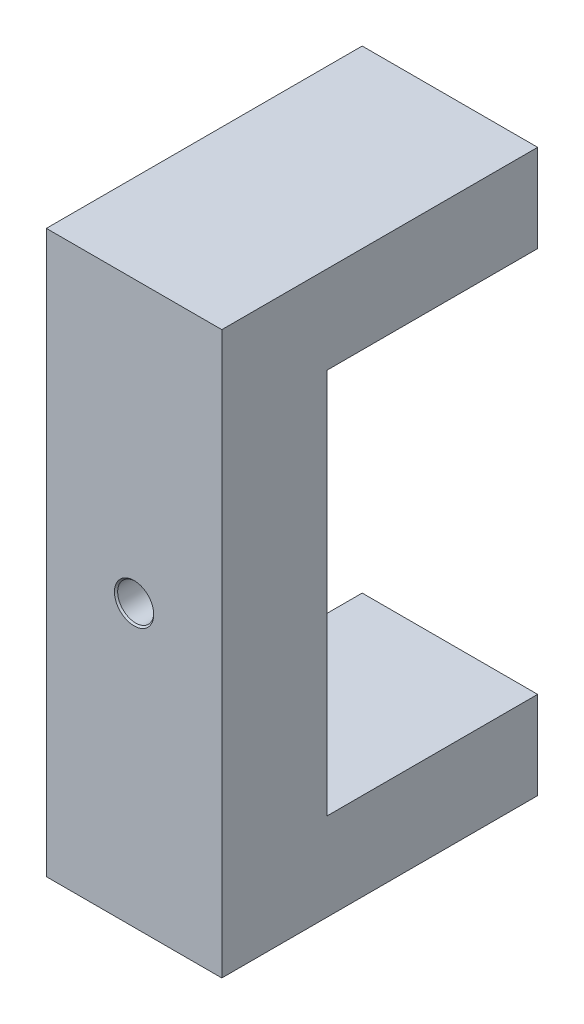
ISO-10303-21;
HEADER;
FILE_DESCRIPTION(('STEP AP214'),'2;1');
FILE_NAME('part.step','',(''),(''),'','','');
FILE_SCHEMA(('AUTOMOTIVE_DESIGN { 1 0 10303 214 1 1 1 1 }'));
ENDSEC;
DATA;
#1=APPLICATION_CONTEXT('core data for automotive mechanical design processes');
#2=APPLICATION_PROTOCOL_DEFINITION('international standard','automotive_design',2000,#1);
#3=PRODUCT_CONTEXT('',#1,'mechanical');
#4=PRODUCT('Part','Part','',(#3));
#5=PRODUCT_RELATED_PRODUCT_CATEGORY('part','',(#4));
#6=PRODUCT_DEFINITION_FORMATION('','',#4);
#7=PRODUCT_DEFINITION_CONTEXT('part definition',#1,'design');
#8=PRODUCT_DEFINITION('design','',#6,#7);
#9=PRODUCT_DEFINITION_SHAPE('','',#8);
#10=(LENGTH_UNIT() NAMED_UNIT(*) SI_UNIT(.MILLI.,.METRE.));
#11=(NAMED_UNIT(*) PLANE_ANGLE_UNIT() SI_UNIT($,.RADIAN.));
#12=(NAMED_UNIT(*) SI_UNIT($,.STERADIAN.) SOLID_ANGLE_UNIT());
#13=UNCERTAINTY_MEASURE_WITH_UNIT(LENGTH_MEASURE(1.E-05),#10,'distance_accuracy_value','');
#14=(GEOMETRIC_REPRESENTATION_CONTEXT(3) GLOBAL_UNCERTAINTY_ASSIGNED_CONTEXT((#13)) GLOBAL_UNIT_ASSIGNED_CONTEXT((#10,
#11,#12)) REPRESENTATION_CONTEXT('',''));
#15=CARTESIAN_POINT('',(0.,0.,0.));
#16=DIRECTION('',(0.,0.,1.));
#17=DIRECTION('',(1.,0.,0.));
#18=AXIS2_PLACEMENT_3D('',#15,#16,#17);
#19=CARTESIAN_POINT('',(15.875,34.925,38.1));
#20=DIRECTION('',(0.,1.,0.));
#21=DIRECTION('',(0.,0.,1.));
#22=AXIS2_PLACEMENT_3D('',#19,#20,#21);
#23=PLANE('',#22);
#24=DIRECTION('',(0.,0.,-1.));
#25=VECTOR('',#24,1.);
#26=CARTESIAN_POINT('',(-15.875,34.925,38.1));
#27=LINE('',#26,#25);
#28=CARTESIAN_POINT('',(-15.875,34.925,38.1));
#29=VERTEX_POINT('',#28);
#30=CARTESIAN_POINT('',(-15.875,34.925,0.));
#31=VERTEX_POINT('',#30);
#32=EDGE_CURVE('E130',#29,#31,#27,.T.);
#33=ORIENTED_EDGE('',*,*,#32,.T.);
#34=DIRECTION('',(-1.,0.,0.));
#35=VECTOR('',#34,1.);
#36=CARTESIAN_POINT('',(15.875,34.925,0.));
#37=LINE('',#36,#35);
#38=CARTESIAN_POINT('',(15.875,34.925,0.));
#39=VERTEX_POINT('',#38);
#40=EDGE_CURVE('E11',#39,#31,#37,.T.);
#41=ORIENTED_EDGE('',*,*,#40,.F.);
#42=DIRECTION('',(0.,0.,-1.));
#43=VECTOR('',#42,1.);
#44=CARTESIAN_POINT('',(15.875,34.925,38.1));
#45=LINE('',#44,#43);
#46=CARTESIAN_POINT('',(15.875,34.925,38.1));
#47=VERTEX_POINT('',#46);
#48=EDGE_CURVE('E145',#47,#39,#45,.T.);
#49=ORIENTED_EDGE('',*,*,#48,.F.);
#50=DIRECTION('',(-1.,0.,0.));
#51=VECTOR('',#50,1.);
#52=CARTESIAN_POINT('',(15.875,34.925,38.1));
#53=LINE('',#52,#51);
#54=EDGE_CURVE('E126',#47,#29,#53,.T.);
#55=ORIENTED_EDGE('',*,*,#54,.T.);
#56=EDGE_LOOP('',(#33,#41,#49,#55));
#57=FACE_BOUND('',#56,.T.);
#58=ADVANCED_FACE('F34',(#57),#23,.F.);
#59=CARTESIAN_POINT('',(15.875,34.925,0.));
#60=DIRECTION('',(0.,0.,1.));
#61=DIRECTION('',(1.,0.,0.));
#62=AXIS2_PLACEMENT_3D('',#59,#60,#61);
#63=PLANE('',#62);
#64=DIRECTION('',(0.,1.,0.));
#65=VECTOR('',#64,1.);
#66=CARTESIAN_POINT('',(-15.875,34.925,0.));
#67=LINE('',#66,#65);
#68=CARTESIAN_POINT('',(-15.875,50.8,0.));
#69=VERTEX_POINT('',#68);
#70=EDGE_CURVE('E133',#31,#69,#67,.T.);
#71=ORIENTED_EDGE('',*,*,#70,.T.);
#72=DIRECTION('',(-1.,0.,0.));
#73=VECTOR('',#72,1.);
#74=CARTESIAN_POINT('',(15.875,50.8,0.));
#75=LINE('',#74,#73);
#76=CARTESIAN_POINT('',(15.875,50.8,0.));
#77=VERTEX_POINT('',#76);
#78=EDGE_CURVE('E42',#77,#69,#75,.T.);
#79=ORIENTED_EDGE('',*,*,#78,.F.);
#80=DIRECTION('',(0.,1.,0.));
#81=VECTOR('',#80,1.);
#82=CARTESIAN_POINT('',(15.875,34.925,0.));
#83=LINE('',#82,#81);
#84=EDGE_CURVE('E93',#39,#77,#83,.T.);
#85=ORIENTED_EDGE('',*,*,#84,.F.);
#86=ORIENTED_EDGE('',*,*,#40,.T.);
#87=EDGE_LOOP('',(#71,#79,#85,#86));
#88=FACE_BOUND('',#87,.T.);
#89=ADVANCED_FACE('F217',(#88),#63,.F.);
#90=CARTESIAN_POINT('',(15.875,50.8,0.));
#91=DIRECTION('',(0.,-1.,0.));
#92=DIRECTION('',(0.,0.,-1.));
#93=AXIS2_PLACEMENT_3D('',#90,#91,#92);
#94=PLANE('',#93);
#95=DIRECTION('',(0.,0.,1.));
#96=VECTOR('',#95,1.);
#97=CARTESIAN_POINT('',(-15.875,50.8,0.));
#98=LINE('',#97,#96);
#99=CARTESIAN_POINT('',(-15.875,50.8,57.15));
#100=VERTEX_POINT('',#99);
#101=EDGE_CURVE('E136',#69,#100,#98,.T.);
#102=ORIENTED_EDGE('',*,*,#101,.T.);
#103=DIRECTION('',(-1.,0.,0.));
#104=VECTOR('',#103,1.);
#105=CARTESIAN_POINT('',(15.875,50.8,57.15));
#106=LINE('',#105,#104);
#107=CARTESIAN_POINT('',(15.875,50.8,57.15));
#108=VERTEX_POINT('',#107);
#109=EDGE_CURVE('E152',#108,#100,#106,.T.);
#110=ORIENTED_EDGE('',*,*,#109,.F.);
#111=DIRECTION('',(0.,0.,1.));
#112=VECTOR('',#111,1.);
#113=CARTESIAN_POINT('',(15.875,50.8,0.));
#114=LINE('',#113,#112);
#115=EDGE_CURVE('E160',#77,#108,#114,.T.);
#116=ORIENTED_EDGE('',*,*,#115,.F.);
#117=ORIENTED_EDGE('',*,*,#78,.T.);
#118=EDGE_LOOP('',(#102,#110,#116,#117));
#119=FACE_BOUND('',#118,.T.);
#120=ADVANCED_FACE('F158',(#119),#94,.F.);
#121=CARTESIAN_POINT('',(15.875,50.8,57.15));
#122=DIRECTION('',(0.,0.,-1.));
#123=DIRECTION('',(-1.,0.,0.));
#124=AXIS2_PLACEMENT_3D('',#121,#122,#123);
#125=PLANE('',#124);
#126=CARTESIAN_POINT('',(0.,0.,57.15));
#127=DIRECTION('',(0.,0.,1.));
#128=DIRECTION('',(1.,0.,0.));
#129=AXIS2_PLACEMENT_3D('',#126,#127,#128);
#130=CIRCLE('',#129,3.556);
#131=CARTESIAN_POINT('',(3.556,0.,57.15));
#132=VERTEX_POINT('',#131);
#133=EDGE_CURVE('E183',#132,#132,#130,.T.);
#134=ORIENTED_EDGE('',*,*,#133,.F.);
#135=EDGE_LOOP('',(#134));
#136=FACE_BOUND('',#135,.T.);
#137=DIRECTION('',(0.,-1.,0.));
#138=VECTOR('',#137,1.);
#139=CARTESIAN_POINT('',(-15.875,50.8,57.15));
#140=LINE('',#139,#138);
#141=CARTESIAN_POINT('',(-15.875,-50.8,57.15));
#142=VERTEX_POINT('',#141);
#143=EDGE_CURVE('E138',#100,#142,#140,.T.);
#144=ORIENTED_EDGE('',*,*,#143,.T.);
#145=DIRECTION('',(-1.,0.,0.));
#146=VECTOR('',#145,1.);
#147=CARTESIAN_POINT('',(15.875,-50.8,57.15));
#148=LINE('',#147,#146);
#149=CARTESIAN_POINT('',(15.875,-50.8,57.15));
#150=VERTEX_POINT('',#149);
#151=EDGE_CURVE('E149',#150,#142,#148,.T.);
#152=ORIENTED_EDGE('',*,*,#151,.F.);
#153=DIRECTION('',(0.,-1.,0.));
#154=VECTOR('',#153,1.);
#155=CARTESIAN_POINT('',(15.875,50.8,57.15));
#156=LINE('',#155,#154);
#157=EDGE_CURVE('E172',#108,#150,#156,.T.);
#158=ORIENTED_EDGE('',*,*,#157,.F.);
#159=ORIENTED_EDGE('',*,*,#109,.T.);
#160=EDGE_LOOP('',(#144,#152,#158,#159));
#161=FACE_BOUND('',#160,.T.);
#162=ADVANCED_FACE('F168',(#136,#161),#125,.F.);
#163=CARTESIAN_POINT('',(15.875,-50.8,57.15));
#164=DIRECTION('',(0.,1.,0.));
#165=DIRECTION('',(0.,0.,1.));
#166=AXIS2_PLACEMENT_3D('',#163,#164,#165);
#167=PLANE('',#166);
#168=DIRECTION('',(0.,0.,-1.));
#169=VECTOR('',#168,1.);
#170=CARTESIAN_POINT('',(-15.875,-50.8,57.15));
#171=LINE('',#170,#169);
#172=CARTESIAN_POINT('',(-15.875,-50.8,0.));
#173=VERTEX_POINT('',#172);
#174=EDGE_CURVE('E140',#142,#173,#171,.T.);
#175=ORIENTED_EDGE('',*,*,#174,.T.);
#176=DIRECTION('',(-1.,0.,0.));
#177=VECTOR('',#176,1.);
#178=CARTESIAN_POINT('',(15.875,-50.8,0.));
#179=LINE('',#178,#177);
#180=CARTESIAN_POINT('',(15.875,-50.8,0.));
#181=VERTEX_POINT('',#180);
#182=EDGE_CURVE('E121',#181,#173,#179,.T.);
#183=ORIENTED_EDGE('',*,*,#182,.F.);
#184=DIRECTION('',(0.,0.,-1.));
#185=VECTOR('',#184,1.);
#186=CARTESIAN_POINT('',(15.875,-50.8,57.15));
#187=LINE('',#186,#185);
#188=EDGE_CURVE('E112',#150,#181,#187,.T.);
#189=ORIENTED_EDGE('',*,*,#188,.F.);
#190=ORIENTED_EDGE('',*,*,#151,.T.);
#191=EDGE_LOOP('',(#175,#183,#189,#190));
#192=FACE_BOUND('',#191,.T.);
#193=ADVANCED_FACE('F171',(#192),#167,.F.);
#194=CARTESIAN_POINT('',(15.875,-50.8,0.));
#195=DIRECTION('',(0.,0.,1.));
#196=DIRECTION('',(1.,0.,0.));
#197=AXIS2_PLACEMENT_3D('',#194,#195,#196);
#198=PLANE('',#197);
#199=DIRECTION('',(0.,1.,0.));
#200=VECTOR('',#199,1.);
#201=CARTESIAN_POINT('',(-15.875,-50.8,0.));
#202=LINE('',#201,#200);
#203=CARTESIAN_POINT('',(-15.875,-34.925,0.));
#204=VERTEX_POINT('',#203);
#205=EDGE_CURVE('E120',#173,#204,#202,.T.);
#206=ORIENTED_EDGE('',*,*,#205,.T.);
#207=DIRECTION('',(-1.,0.,0.));
#208=VECTOR('',#207,1.);
#209=CARTESIAN_POINT('',(15.875,-34.925,0.));
#210=LINE('',#209,#208);
#211=CARTESIAN_POINT('',(15.875,-34.925,0.));
#212=VERTEX_POINT('',#211);
#213=EDGE_CURVE('E117',#212,#204,#210,.T.);
#214=ORIENTED_EDGE('',*,*,#213,.F.);
#215=DIRECTION('',(0.,1.,0.));
#216=VECTOR('',#215,1.);
#217=CARTESIAN_POINT('',(15.875,-50.8,0.));
#218=LINE('',#217,#216);
#219=EDGE_CURVE('E106',#181,#212,#218,.T.);
#220=ORIENTED_EDGE('',*,*,#219,.F.);
#221=ORIENTED_EDGE('',*,*,#182,.T.);
#222=EDGE_LOOP('',(#206,#214,#220,#221));
#223=FACE_BOUND('',#222,.T.);
#224=ADVANCED_FACE('F118',(#223),#198,.F.);
#225=CARTESIAN_POINT('',(15.875,-34.925,0.));
#226=DIRECTION('',(0.,-1.,0.));
#227=DIRECTION('',(0.,0.,-1.));
#228=AXIS2_PLACEMENT_3D('',#225,#226,#227);
#229=PLANE('',#228);
#230=DIRECTION('',(0.,0.,1.));
#231=VECTOR('',#230,1.);
#232=CARTESIAN_POINT('',(-15.875,-34.925,0.));
#233=LINE('',#232,#231);
#234=CARTESIAN_POINT('',(-15.875,-34.925,38.1));
#235=VERTEX_POINT('',#234);
#236=EDGE_CURVE('E79',#204,#235,#233,.T.);
#237=ORIENTED_EDGE('',*,*,#236,.T.);
#238=DIRECTION('',(-1.,0.,0.));
#239=VECTOR('',#238,1.);
#240=CARTESIAN_POINT('',(15.875,-34.925,38.1));
#241=LINE('',#240,#239);
#242=CARTESIAN_POINT('',(15.875,-34.925,38.1));
#243=VERTEX_POINT('',#242);
#244=EDGE_CURVE('E122',#243,#235,#241,.T.);
#245=ORIENTED_EDGE('',*,*,#244,.F.);
#246=DIRECTION('',(0.,0.,1.));
#247=VECTOR('',#246,1.);
#248=CARTESIAN_POINT('',(15.875,-34.925,0.));
#249=LINE('',#248,#247);
#250=EDGE_CURVE('E110',#212,#243,#249,.T.);
#251=ORIENTED_EDGE('',*,*,#250,.F.);
#252=ORIENTED_EDGE('',*,*,#213,.T.);
#253=EDGE_LOOP('',(#237,#245,#251,#252));
#254=FACE_BOUND('',#253,.T.);
#255=ADVANCED_FACE('F124',(#254),#229,.F.);
#256=CARTESIAN_POINT('',(15.875,-34.925,38.1));
#257=DIRECTION('',(0.,0.,1.));
#258=DIRECTION('',(1.,0.,0.));
#259=AXIS2_PLACEMENT_3D('',#256,#257,#258);
#260=PLANE('',#259);
#261=CARTESIAN_POINT('',(0.,0.,38.1));
#262=DIRECTION('',(0.,0.,1.));
#263=DIRECTION('',(1.,0.,0.));
#264=AXIS2_PLACEMENT_3D('',#261,#262,#263);
#265=CIRCLE('',#264,3.556);
#266=CARTESIAN_POINT('',(3.556,0.,38.1));
#267=VERTEX_POINT('',#266);
#268=EDGE_CURVE('E186',#267,#267,#265,.T.);
#269=ORIENTED_EDGE('',*,*,#268,.T.);
#270=EDGE_LOOP('',(#269));
#271=FACE_BOUND('',#270,.T.);
#272=DIRECTION('',(0.,1.,0.));
#273=VECTOR('',#272,1.);
#274=CARTESIAN_POINT('',(-15.875,-34.925,38.1));
#275=LINE('',#274,#273);
#276=EDGE_CURVE('E85',#235,#29,#275,.T.);
#277=ORIENTED_EDGE('',*,*,#276,.T.);
#278=ORIENTED_EDGE('',*,*,#54,.F.);
#279=DIRECTION('',(0.,1.,0.));
#280=VECTOR('',#279,1.);
#281=CARTESIAN_POINT('',(15.875,-34.925,38.1));
#282=LINE('',#281,#280);
#283=EDGE_CURVE('E50',#243,#47,#282,.T.);
#284=ORIENTED_EDGE('',*,*,#283,.F.);
#285=ORIENTED_EDGE('',*,*,#244,.T.);
#286=EDGE_LOOP('',(#277,#278,#284,#285));
#287=FACE_BOUND('',#286,.T.);
#288=ADVANCED_FACE('F190',(#271,#287),#260,.F.);
#289=CARTESIAN_POINT('',(15.875,0.,0.));
#290=DIRECTION('',(1.,0.,0.));
#291=DIRECTION('',(0.,0.,-1.));
#292=AXIS2_PLACEMENT_3D('',#289,#290,#291);
#293=PLANE('',#292);
#294=ORIENTED_EDGE('',*,*,#48,.T.);
#295=ORIENTED_EDGE('',*,*,#84,.T.);
#296=ORIENTED_EDGE('',*,*,#115,.T.);
#297=ORIENTED_EDGE('',*,*,#157,.T.);
#298=ORIENTED_EDGE('',*,*,#188,.T.);
#299=ORIENTED_EDGE('',*,*,#219,.T.);
#300=ORIENTED_EDGE('',*,*,#250,.T.);
#301=ORIENTED_EDGE('',*,*,#283,.T.);
#302=EDGE_LOOP('',(#294,#295,#296,#297,#298,#299,#300,#301));
#303=FACE_BOUND('',#302,.T.);
#304=ADVANCED_FACE('F108',(#303),#293,.T.);
#305=CARTESIAN_POINT('',(-15.875,0.,0.));
#306=DIRECTION('',(1.,0.,0.));
#307=DIRECTION('',(0.,0.,-1.));
#308=AXIS2_PLACEMENT_3D('',#305,#306,#307);
#309=PLANE('',#308);
#310=ORIENTED_EDGE('',*,*,#32,.F.);
#311=ORIENTED_EDGE('',*,*,#276,.F.);
#312=ORIENTED_EDGE('',*,*,#236,.F.);
#313=ORIENTED_EDGE('',*,*,#205,.F.);
#314=ORIENTED_EDGE('',*,*,#174,.F.);
#315=ORIENTED_EDGE('',*,*,#143,.F.);
#316=ORIENTED_EDGE('',*,*,#101,.F.);
#317=ORIENTED_EDGE('',*,*,#70,.F.);
#318=EDGE_LOOP('',(#310,#311,#312,#313,#314,#315,#316,#317));
#319=FACE_BOUND('',#318,.T.);
#320=ADVANCED_FACE('F164',(#319),#309,.F.);
#321=CARTESIAN_POINT('',(0.,0.,38.3921));
#322=DIRECTION('',(0.,0.,-1.));
#323=DIRECTION('',(-1.,0.,0.));
#324=AXIS2_PLACEMENT_3D('',#321,#322,#323);
#325=CONICAL_SURFACE('',#324,3.2639,0.785398163397452);
#326=ORIENTED_EDGE('',*,*,#268,.F.);
#327=EDGE_LOOP('',(#326));
#328=FACE_BOUND('',#327,.T.);
#329=CARTESIAN_POINT('',(0.,0.,38.3921));
#330=DIRECTION('',(0.,0.,1.));
#331=DIRECTION('',(1.,0.,0.));
#332=AXIS2_PLACEMENT_3D('',#329,#330,#331);
#333=CIRCLE('',#332,3.2639);
#334=CARTESIAN_POINT('',(3.2639,0.,38.3921));
#335=VERTEX_POINT('',#334);
#336=EDGE_CURVE('E134',#335,#335,#333,.T.);
#337=ORIENTED_EDGE('',*,*,#336,.T.);
#338=EDGE_LOOP('',(#337));
#339=FACE_BOUND('',#338,.T.);
#340=ADVANCED_FACE('F192',(#328,#339),#325,.F.);
#341=CARTESIAN_POINT('',(0.,0.,57.15));
#342=DIRECTION('',(0.,0.,1.));
#343=DIRECTION('',(1.,0.,0.));
#344=AXIS2_PLACEMENT_3D('',#341,#342,#343);
#345=CYLINDRICAL_SURFACE('',#344,3.2639);
#346=ORIENTED_EDGE('',*,*,#336,.F.);
#347=EDGE_LOOP('',(#346));
#348=FACE_BOUND('',#347,.T.);
#349=CARTESIAN_POINT('',(0.,0.,56.8579));
#350=DIRECTION('',(0.,0.,1.));
#351=DIRECTION('',(1.,0.,0.));
#352=AXIS2_PLACEMENT_3D('',#349,#350,#351);
#353=CIRCLE('',#352,3.2639);
#354=CARTESIAN_POINT('',(3.2639,0.,56.8579));
#355=VERTEX_POINT('',#354);
#356=EDGE_CURVE('E180',#355,#355,#353,.T.);
#357=ORIENTED_EDGE('',*,*,#356,.T.);
#358=EDGE_LOOP('',(#357));
#359=FACE_BOUND('',#358,.T.);
#360=ADVANCED_FACE('F195',(#348,#359),#345,.F.);
#361=CARTESIAN_POINT('',(0.,0.,57.15));
#362=DIRECTION('',(0.,0.,1.));
#363=DIRECTION('',(1.,0.,0.));
#364=AXIS2_PLACEMENT_3D('',#361,#362,#363);
#365=CONICAL_SURFACE('',#364,3.556,0.785398163397444);
#366=ORIENTED_EDGE('',*,*,#356,.F.);
#367=EDGE_LOOP('',(#366));
#368=FACE_BOUND('',#367,.T.);
#369=ORIENTED_EDGE('',*,*,#133,.T.);
#370=EDGE_LOOP('',(#369));
#371=FACE_BOUND('',#370,.T.);
#372=ADVANCED_FACE('F201',(#368,#371),#365,.F.);
#373=CLOSED_SHELL('',(#58,#89,#120,#162,#193,#224,#255,#288,#304,#320,#340,#360,#372));
#374=MANIFOLD_SOLID_BREP('B2',#373);
#375=ADVANCED_BREP_SHAPE_REPRESENTATION('',(#18,#374),#14);
#376=SHAPE_DEFINITION_REPRESENTATION(#9,#375);
ENDSEC;
END-ISO-10303-21;
